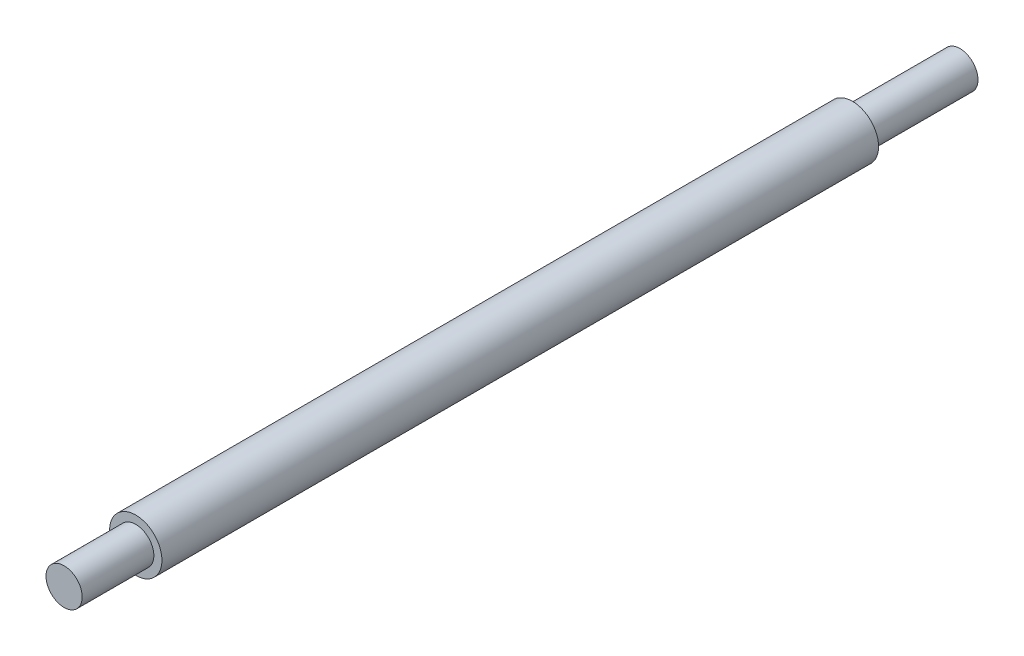
ISO-10303-21;
HEADER;
FILE_DESCRIPTION(('STEP AP214'),'2;1');
FILE_NAME('part.step','',(''),(''),'','','');
FILE_SCHEMA(('AUTOMOTIVE_DESIGN { 1 0 10303 214 1 1 1 1 }'));
ENDSEC;
DATA;
#1=APPLICATION_CONTEXT('core data for automotive mechanical design processes');
#2=APPLICATION_PROTOCOL_DEFINITION('international standard','automotive_design',2000,#1);
#3=PRODUCT_CONTEXT('',#1,'mechanical');
#4=PRODUCT('Part','Part','',(#3));
#5=PRODUCT_RELATED_PRODUCT_CATEGORY('part','',(#4));
#6=PRODUCT_DEFINITION_FORMATION('','',#4);
#7=PRODUCT_DEFINITION_CONTEXT('part definition',#1,'design');
#8=PRODUCT_DEFINITION('design','',#6,#7);
#9=PRODUCT_DEFINITION_SHAPE('','',#8);
#10=(LENGTH_UNIT() NAMED_UNIT(*) SI_UNIT(.MILLI.,.METRE.));
#11=(NAMED_UNIT(*) PLANE_ANGLE_UNIT() SI_UNIT($,.RADIAN.));
#12=(NAMED_UNIT(*) SI_UNIT($,.STERADIAN.) SOLID_ANGLE_UNIT());
#13=UNCERTAINTY_MEASURE_WITH_UNIT(LENGTH_MEASURE(1.E-05),#10,'distance_accuracy_value','');
#14=(GEOMETRIC_REPRESENTATION_CONTEXT(3) GLOBAL_UNCERTAINTY_ASSIGNED_CONTEXT((#13)) GLOBAL_UNIT_ASSIGNED_CONTEXT((#10,
#11,#12)) REPRESENTATION_CONTEXT('',''));
#15=CARTESIAN_POINT('',(0.,0.,0.));
#16=DIRECTION('',(0.,0.,1.));
#17=DIRECTION('',(1.,0.,0.));
#18=AXIS2_PLACEMENT_3D('',#15,#16,#17);
#19=CARTESIAN_POINT('',(0.,0.,33.02));
#20=DIRECTION('',(0.,0.,-1.));
#21=DIRECTION('',(-1.,0.,0.));
#22=AXIS2_PLACEMENT_3D('',#19,#20,#21);
#23=CYLINDRICAL_SURFACE('',#22,1.2827);
#24=CARTESIAN_POINT('',(0.,0.,25.4));
#25=DIRECTION('',(0.,0.,1.));
#26=DIRECTION('',(1.,0.,0.));
#27=AXIS2_PLACEMENT_3D('',#24,#25,#26);
#28=CIRCLE('',#27,1.2827);
#29=CARTESIAN_POINT('',(-1.2827,0.,25.4));
#30=VERTEX_POINT('',#29);
#31=EDGE_CURVE('E10',#30,#30,#28,.T.);
#32=CARTESIAN_POINT('',(0.,0.,30.48));
#33=DIRECTION('',(0.,0.,1.));
#34=DIRECTION('',(1.,0.,0.));
#35=AXIS2_PLACEMENT_3D('',#32,#33,#34);
#36=CIRCLE('',#35,1.2827);
#37=CARTESIAN_POINT('',(-1.2827,0.,30.48));
#38=VERTEX_POINT('',#37);
#39=EDGE_CURVE('E65',#38,#38,#36,.T.);
#40=CARTESIAN_POINT('',(-1.2827,0.,25.4));
#41=CARTESIAN_POINT('',(-1.2827,0.,25.4529166666667));
#42=CARTESIAN_POINT('',(-1.2827,0.,25.5058333333333));
#43=CARTESIAN_POINT('',(-1.2827,0.,25.6116666666667));
#44=CARTESIAN_POINT('',(-1.2827,0.,25.6645833333333));
#45=CARTESIAN_POINT('',(-1.2827,0.,25.7704166666667));
#46=CARTESIAN_POINT('',(-1.2827,0.,25.8233333333333));
#47=CARTESIAN_POINT('',(-1.2827,0.,25.9291666666667));
#48=CARTESIAN_POINT('',(-1.2827,0.,25.9820833333333));
#49=CARTESIAN_POINT('',(-1.2827,0.,26.0879166666667));
#50=CARTESIAN_POINT('',(-1.2827,0.,26.1408333333333));
#51=CARTESIAN_POINT('',(-1.2827,0.,26.2466666666667));
#52=CARTESIAN_POINT('',(-1.2827,0.,26.2995833333333));
#53=CARTESIAN_POINT('',(-1.2827,0.,26.4054166666667));
#54=CARTESIAN_POINT('',(-1.2827,0.,26.4583333333333));
#55=CARTESIAN_POINT('',(-1.2827,0.,26.5641666666667));
#56=CARTESIAN_POINT('',(-1.2827,0.,26.6170833333333));
#57=CARTESIAN_POINT('',(-1.2827,0.,26.7229166666667));
#58=CARTESIAN_POINT('',(-1.2827,0.,26.7758333333333));
#59=CARTESIAN_POINT('',(-1.2827,0.,26.8816666666667));
#60=CARTESIAN_POINT('',(-1.2827,0.,26.9345833333333));
#61=CARTESIAN_POINT('',(-1.2827,0.,27.0404166666667));
#62=CARTESIAN_POINT('',(-1.2827,0.,27.0933333333333));
#63=CARTESIAN_POINT('',(-1.2827,0.,27.1991666666667));
#64=CARTESIAN_POINT('',(-1.2827,0.,27.2520833333333));
#65=CARTESIAN_POINT('',(-1.2827,0.,27.3579166666667));
#66=CARTESIAN_POINT('',(-1.2827,0.,27.4108333333333));
#67=CARTESIAN_POINT('',(-1.2827,0.,27.5166666666667));
#68=CARTESIAN_POINT('',(-1.2827,0.,27.5695833333333));
#69=CARTESIAN_POINT('',(-1.2827,0.,27.6754166666667));
#70=CARTESIAN_POINT('',(-1.2827,0.,27.7283333333333));
#71=CARTESIAN_POINT('',(-1.2827,0.,27.8341666666667));
#72=CARTESIAN_POINT('',(-1.2827,0.,27.8870833333333));
#73=CARTESIAN_POINT('',(-1.2827,0.,27.9929166666667));
#74=CARTESIAN_POINT('',(-1.2827,0.,28.0458333333333));
#75=CARTESIAN_POINT('',(-1.2827,0.,28.1516666666667));
#76=CARTESIAN_POINT('',(-1.2827,0.,28.2045833333333));
#77=CARTESIAN_POINT('',(-1.2827,0.,28.3104166666667));
#78=CARTESIAN_POINT('',(-1.2827,0.,28.3633333333333));
#79=CARTESIAN_POINT('',(-1.2827,0.,28.4691666666667));
#80=CARTESIAN_POINT('',(-1.2827,0.,28.5220833333333));
#81=CARTESIAN_POINT('',(-1.2827,0.,28.6279166666667));
#82=CARTESIAN_POINT('',(-1.2827,0.,28.6808333333333));
#83=CARTESIAN_POINT('',(-1.2827,0.,28.7866666666667));
#84=CARTESIAN_POINT('',(-1.2827,0.,28.8395833333333));
#85=CARTESIAN_POINT('',(-1.2827,0.,28.9454166666667));
#86=CARTESIAN_POINT('',(-1.2827,0.,28.9983333333333));
#87=CARTESIAN_POINT('',(-1.2827,0.,29.1041666666667));
#88=CARTESIAN_POINT('',(-1.2827,0.,29.1570833333333));
#89=CARTESIAN_POINT('',(-1.2827,0.,29.2629166666667));
#90=CARTESIAN_POINT('',(-1.2827,0.,29.3158333333333));
#91=CARTESIAN_POINT('',(-1.2827,0.,29.4216666666667));
#92=CARTESIAN_POINT('',(-1.2827,0.,29.4745833333333));
#93=CARTESIAN_POINT('',(-1.2827,0.,29.5804166666667));
#94=CARTESIAN_POINT('',(-1.2827,0.,29.6333333333333));
#95=CARTESIAN_POINT('',(-1.2827,0.,29.7391666666667));
#96=CARTESIAN_POINT('',(-1.2827,0.,29.7920833333333));
#97=CARTESIAN_POINT('',(-1.2827,0.,29.8979166666667));
#98=CARTESIAN_POINT('',(-1.2827,0.,29.9508333333333));
#99=CARTESIAN_POINT('',(-1.2827,0.,30.0566666666667));
#100=CARTESIAN_POINT('',(-1.2827,0.,30.1095833333333));
#101=CARTESIAN_POINT('',(-1.2827,0.,30.2154166666667));
#102=CARTESIAN_POINT('',(-1.2827,0.,30.2683333333333));
#103=CARTESIAN_POINT('',(-1.2827,0.,30.3741666666667));
#104=CARTESIAN_POINT('',(-1.2827,0.,30.4270833333333));
#105=CARTESIAN_POINT('',(-1.2827,0.,30.48));
#106=B_SPLINE_CURVE_WITH_KNOTS('',3,(#40,#41,#42,#43,#44,#45,#46,#47,#48,#49,#50,#51,#52,#53,
#54,#55,#56,#57,#58,#59,#60,#61,#62,#63,#64,#65,#66,#67,#68,#69,#70,#71,#72,#73,#74,#75,#76,#77,
#78,#79,#80,#81,#82,#83,#84,#85,#86,#87,#88,#89,#90,#91,#92,#93,#94,#95,#96,#97,#98,#99,#100,
#101,#102,#103,#104,#105),.UNSPECIFIED.,.F.,.F.,(4,2,2,2,2,2,2,2,2,2,2,2,2,2,2,2,2,2,2,2,2,2,2,
2,2,2,2,2,2,2,2,2,4),(0.,0.158750000000003,0.317500000000002,0.476250000000001,0.635,
0.793749999999999,0.952500000000002,1.11125,1.27,1.42875,1.5875,1.74625,1.905,2.06375,2.2225,
2.38125,2.54,2.69875,2.8575,3.01625,3.175,3.33375,3.4925,3.65125,3.81,3.96875,4.1275,4.28625,
4.445,4.60375,4.7625,4.92125,5.08),.UNSPECIFIED.);
#107=EDGE_CURVE('BSEAM43',#30,#38,#106,.T.);
#108=ORIENTED_EDGE('',*,*,#31,.T.);
#109=ORIENTED_EDGE('',*,*,#39,.F.);
#110=ORIENTED_EDGE('',*,*,#107,.T.);
#111=ORIENTED_EDGE('',*,*,#107,.F.);
#112=EDGE_LOOP('',(#108,#110,#109,#111));
#113=FACE_BOUND('',#112,.T.);
#114=ADVANCED_FACE('F43',(#113),#23,.T.);
#115=CARTESIAN_POINT('',(0.,0.,25.4));
#116=DIRECTION('',(0.,0.,-1.));
#117=DIRECTION('',(-1.,0.,0.));
#118=AXIS2_PLACEMENT_3D('',#115,#116,#117);
#119=CYLINDRICAL_SURFACE('',#118,1.8542);
#120=CARTESIAN_POINT('',(0.,0.,25.4));
#121=DIRECTION('',(0.,0.,1.));
#122=DIRECTION('',(1.,0.,0.));
#123=AXIS2_PLACEMENT_3D('',#120,#121,#122);
#124=CIRCLE('',#123,1.8542);
#125=CARTESIAN_POINT('',(1.8542,0.,25.4));
#126=VERTEX_POINT('',#125);
#127=EDGE_CURVE('E52',#126,#126,#124,.T.);
#128=ORIENTED_EDGE('',*,*,#127,.F.);
#129=EDGE_LOOP('',(#128));
#130=FACE_BOUND('',#129,.T.);
#131=CARTESIAN_POINT('',(0.,0.,-25.4));
#132=DIRECTION('',(0.,0.,1.));
#133=DIRECTION('',(1.,0.,0.));
#134=AXIS2_PLACEMENT_3D('',#131,#132,#133);
#135=CIRCLE('',#134,1.8542);
#136=CARTESIAN_POINT('',(1.8542,0.,-25.4));
#137=VERTEX_POINT('',#136);
#138=EDGE_CURVE('E47',#137,#137,#135,.T.);
#139=ORIENTED_EDGE('',*,*,#138,.T.);
#140=EDGE_LOOP('',(#139));
#141=FACE_BOUND('',#140,.T.);
#142=ADVANCED_FACE('F45',(#130,#141),#119,.T.);
#143=CARTESIAN_POINT('',(0.,0.,25.4));
#144=DIRECTION('',(0.,0.,1.));
#145=DIRECTION('',(1.,0.,0.));
#146=AXIS2_PLACEMENT_3D('',#143,#144,#145);
#147=PLANE('',#146);
#148=ORIENTED_EDGE('',*,*,#31,.F.);
#149=EDGE_LOOP('',(#148));
#150=FACE_BOUND('',#149,.T.);
#151=ORIENTED_EDGE('',*,*,#127,.T.);
#152=EDGE_LOOP('',(#151));
#153=FACE_BOUND('',#152,.T.);
#154=ADVANCED_FACE('F81',(#150,#153),#147,.T.);
#155=CARTESIAN_POINT('',(0.,0.,-25.4));
#156=DIRECTION('',(0.,0.,1.));
#157=DIRECTION('',(1.,0.,0.));
#158=AXIS2_PLACEMENT_3D('',#155,#156,#157);
#159=PLANE('',#158);
#160=CARTESIAN_POINT('',(0.,0.,-25.4));
#161=DIRECTION('',(0.,0.,1.));
#162=DIRECTION('',(1.,0.,0.));
#163=AXIS2_PLACEMENT_3D('',#160,#161,#162);
#164=CIRCLE('',#163,1.2827);
#165=CARTESIAN_POINT('',(1.2827,0.,-25.4));
#166=VERTEX_POINT('',#165);
#167=EDGE_CURVE('E60',#166,#166,#164,.T.);
#168=ORIENTED_EDGE('',*,*,#167,.T.);
#169=EDGE_LOOP('',(#168));
#170=FACE_BOUND('',#169,.T.);
#171=ORIENTED_EDGE('',*,*,#138,.F.);
#172=EDGE_LOOP('',(#171));
#173=FACE_BOUND('',#172,.T.);
#174=ADVANCED_FACE('F88',(#170,#173),#159,.F.);
#175=CARTESIAN_POINT('',(0.,0.,-33.02));
#176=DIRECTION('',(0.,0.,1.));
#177=DIRECTION('',(1.,0.,0.));
#178=AXIS2_PLACEMENT_3D('',#175,#176,#177);
#179=CYLINDRICAL_SURFACE('',#178,1.2827);
#180=CARTESIAN_POINT('',(0.,0.,-33.02));
#181=DIRECTION('',(0.,0.,1.));
#182=DIRECTION('',(1.,0.,0.));
#183=AXIS2_PLACEMENT_3D('',#180,#181,#182);
#184=CIRCLE('',#183,1.2827);
#185=CARTESIAN_POINT('',(1.2827,0.,-33.02));
#186=VERTEX_POINT('',#185);
#187=EDGE_CURVE('E64',#186,#186,#184,.T.);
#188=CARTESIAN_POINT('',(1.2827,0.,-33.02));
#189=CARTESIAN_POINT('',(1.2827,0.,-32.940625));
#190=CARTESIAN_POINT('',(1.2827,0.,-32.86125));
#191=CARTESIAN_POINT('',(1.2827,0.,-32.7025));
#192=CARTESIAN_POINT('',(1.2827,0.,-32.623125));
#193=CARTESIAN_POINT('',(1.2827,0.,-32.464375));
#194=CARTESIAN_POINT('',(1.2827,0.,-32.385));
#195=CARTESIAN_POINT('',(1.2827,0.,-32.22625));
#196=CARTESIAN_POINT('',(1.2827,0.,-32.146875));
#197=CARTESIAN_POINT('',(1.2827,0.,-31.988125));
#198=CARTESIAN_POINT('',(1.2827,0.,-31.90875));
#199=CARTESIAN_POINT('',(1.2827,0.,-31.75));
#200=CARTESIAN_POINT('',(1.2827,0.,-31.670625));
#201=CARTESIAN_POINT('',(1.2827,0.,-31.511875));
#202=CARTESIAN_POINT('',(1.2827,0.,-31.4325));
#203=CARTESIAN_POINT('',(1.2827,0.,-31.27375));
#204=CARTESIAN_POINT('',(1.2827,0.,-31.194375));
#205=CARTESIAN_POINT('',(1.2827,0.,-31.035625));
#206=CARTESIAN_POINT('',(1.2827,0.,-30.95625));
#207=CARTESIAN_POINT('',(1.2827,0.,-30.7975));
#208=CARTESIAN_POINT('',(1.2827,0.,-30.718125));
#209=CARTESIAN_POINT('',(1.2827,0.,-30.559375));
#210=CARTESIAN_POINT('',(1.2827,0.,-30.48));
#211=CARTESIAN_POINT('',(1.2827,0.,-30.32125));
#212=CARTESIAN_POINT('',(1.2827,0.,-30.241875));
#213=CARTESIAN_POINT('',(1.2827,0.,-30.083125));
#214=CARTESIAN_POINT('',(1.2827,0.,-30.00375));
#215=CARTESIAN_POINT('',(1.2827,0.,-29.845));
#216=CARTESIAN_POINT('',(1.2827,0.,-29.765625));
#217=CARTESIAN_POINT('',(1.2827,0.,-29.606875));
#218=CARTESIAN_POINT('',(1.2827,0.,-29.5275));
#219=CARTESIAN_POINT('',(1.2827,0.,-29.36875));
#220=CARTESIAN_POINT('',(1.2827,0.,-29.289375));
#221=CARTESIAN_POINT('',(1.2827,0.,-29.130625));
#222=CARTESIAN_POINT('',(1.2827,0.,-29.05125));
#223=CARTESIAN_POINT('',(1.2827,0.,-28.8925));
#224=CARTESIAN_POINT('',(1.2827,0.,-28.813125));
#225=CARTESIAN_POINT('',(1.2827,0.,-28.654375));
#226=CARTESIAN_POINT('',(1.2827,0.,-28.575));
#227=CARTESIAN_POINT('',(1.2827,0.,-28.41625));
#228=CARTESIAN_POINT('',(1.2827,0.,-28.336875));
#229=CARTESIAN_POINT('',(1.2827,0.,-28.178125));
#230=CARTESIAN_POINT('',(1.2827,0.,-28.09875));
#231=CARTESIAN_POINT('',(1.2827,0.,-27.94));
#232=CARTESIAN_POINT('',(1.2827,0.,-27.860625));
#233=CARTESIAN_POINT('',(1.2827,0.,-27.701875));
#234=CARTESIAN_POINT('',(1.2827,0.,-27.6225));
#235=CARTESIAN_POINT('',(1.2827,0.,-27.46375));
#236=CARTESIAN_POINT('',(1.2827,0.,-27.384375));
#237=CARTESIAN_POINT('',(1.2827,0.,-27.225625));
#238=CARTESIAN_POINT('',(1.2827,0.,-27.14625));
#239=CARTESIAN_POINT('',(1.2827,0.,-26.9875));
#240=CARTESIAN_POINT('',(1.2827,0.,-26.908125));
#241=CARTESIAN_POINT('',(1.2827,0.,-26.749375));
#242=CARTESIAN_POINT('',(1.2827,0.,-26.67));
#243=CARTESIAN_POINT('',(1.2827,0.,-26.51125));
#244=CARTESIAN_POINT('',(1.2827,0.,-26.431875));
#245=CARTESIAN_POINT('',(1.2827,0.,-26.273125));
#246=CARTESIAN_POINT('',(1.2827,0.,-26.19375));
#247=CARTESIAN_POINT('',(1.2827,0.,-26.035));
#248=CARTESIAN_POINT('',(1.2827,0.,-25.955625));
#249=CARTESIAN_POINT('',(1.2827,0.,-25.796875));
#250=CARTESIAN_POINT('',(1.2827,0.,-25.7175));
#251=CARTESIAN_POINT('',(1.2827,0.,-25.55875));
#252=CARTESIAN_POINT('',(1.2827,0.,-25.479375));
#253=CARTESIAN_POINT('',(1.2827,0.,-25.4));
#254=B_SPLINE_CURVE_WITH_KNOTS('',3,(#188,#189,#190,#191,#192,#193,#194,#195,#196,#197,#198,
#199,#200,#201,#202,#203,#204,#205,#206,#207,#208,#209,#210,#211,#212,#213,#214,#215,#216,#217,
#218,#219,#220,#221,#222,#223,#224,#225,#226,#227,#228,#229,#230,#231,#232,#233,#234,#235,#236,
#237,#238,#239,#240,#241,#242,#243,#244,#245,#246,#247,#248,#249,#250,#251,#252,#253),
.UNSPECIFIED.,.F.,.F.,(4,2,2,2,2,2,2,2,2,2,2,2,2,2,2,2,2,2,2,2,2,2,2,2,2,2,2,2,2,2,2,2,4),(0.,
0.238124999999999,0.476249999999998,0.714374999999996,0.952499999999995,1.19062499999999,
1.42875,1.666875,1.905,2.143125,2.38125,2.619375,2.8575,3.095625,3.33375,3.571875,3.81,4.048125,
4.28625,4.524375,4.7625,5.000625,5.23875,5.476875,5.715,5.953125,6.19125,6.429375,6.6675,
6.905625,7.14375,7.381875,7.62),.UNSPECIFIED.);
#255=EDGE_CURVE('BSEAM85',#186,#166,#254,.T.);
#256=ORIENTED_EDGE('',*,*,#187,.T.);
#257=ORIENTED_EDGE('',*,*,#167,.F.);
#258=ORIENTED_EDGE('',*,*,#255,.T.);
#259=ORIENTED_EDGE('',*,*,#255,.F.);
#260=EDGE_LOOP('',(#256,#258,#257,#259));
#261=FACE_BOUND('',#260,.T.);
#262=ADVANCED_FACE('F85',(#261),#179,.T.);
#263=CARTESIAN_POINT('',(0.,0.,-33.02));
#264=DIRECTION('',(0.,0.,-1.));
#265=DIRECTION('',(1.,0.,0.));
#266=AXIS2_PLACEMENT_3D('',#263,#264,#265);
#267=PLANE('',#266);
#268=ORIENTED_EDGE('',*,*,#187,.F.);
#269=EDGE_LOOP('',(#268));
#270=FACE_BOUND('',#269,.T.);
#271=ADVANCED_FACE('F95',(#270),#267,.T.);
#272=CARTESIAN_POINT('',(0.,0.,30.48));
#273=DIRECTION('',(0.,0.,1.));
#274=DIRECTION('',(1.,0.,0.));
#275=AXIS2_PLACEMENT_3D('',#272,#273,#274);
#276=PLANE('',#275);
#277=ORIENTED_EDGE('',*,*,#39,.T.);
#278=EDGE_LOOP('',(#277));
#279=FACE_BOUND('',#278,.T.);
#280=ADVANCED_FACE('F74',(#279),#276,.T.);
#281=CLOSED_SHELL('',(#114,#142,#154,#174,#262,#271,#280));
#282=MANIFOLD_SOLID_BREP('B2',#281);
#283=ADVANCED_BREP_SHAPE_REPRESENTATION('',(#18,#282),#14);
#284=SHAPE_DEFINITION_REPRESENTATION(#9,#283);
ENDSEC;
END-ISO-10303-21;
